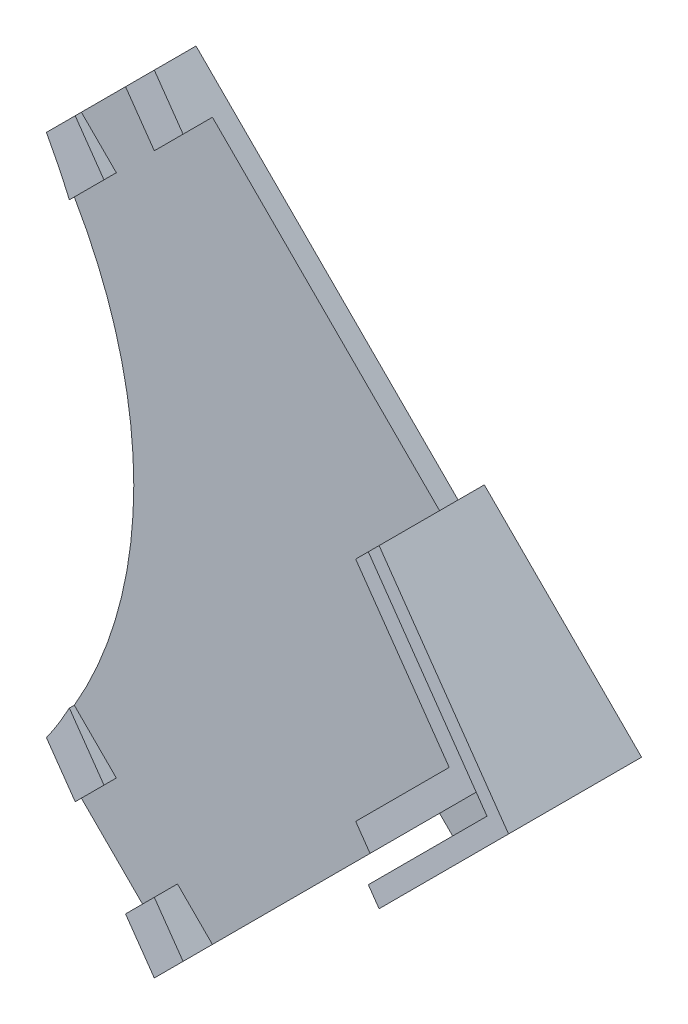
ISO-10303-21;
HEADER;
FILE_DESCRIPTION(('STEP AP214'),'2;1');
FILE_NAME('part.step','',(''),(''),'','','');
FILE_SCHEMA(('AUTOMOTIVE_DESIGN { 1 0 10303 214 1 1 1 1 }'));
ENDSEC;
DATA;
#1=APPLICATION_CONTEXT('core data for automotive mechanical design processes');
#2=APPLICATION_PROTOCOL_DEFINITION('international standard','automotive_design',2000,#1);
#3=PRODUCT_CONTEXT('',#1,'mechanical');
#4=PRODUCT('Part','Part','',(#3));
#5=PRODUCT_RELATED_PRODUCT_CATEGORY('part','',(#4));
#6=PRODUCT_DEFINITION_FORMATION('','',#4);
#7=PRODUCT_DEFINITION_CONTEXT('part definition',#1,'design');
#8=PRODUCT_DEFINITION('design','',#6,#7);
#9=PRODUCT_DEFINITION_SHAPE('','',#8);
#10=(LENGTH_UNIT() NAMED_UNIT(*) SI_UNIT(.MILLI.,.METRE.));
#11=(NAMED_UNIT(*) PLANE_ANGLE_UNIT() SI_UNIT($,.RADIAN.));
#12=(NAMED_UNIT(*) SI_UNIT($,.STERADIAN.) SOLID_ANGLE_UNIT());
#13=UNCERTAINTY_MEASURE_WITH_UNIT(LENGTH_MEASURE(1.E-05),#10,'distance_accuracy_value','');
#14=(GEOMETRIC_REPRESENTATION_CONTEXT(3) GLOBAL_UNCERTAINTY_ASSIGNED_CONTEXT((#13)) GLOBAL_UNIT_ASSIGNED_CONTEXT((#10,
#11,#12)) REPRESENTATION_CONTEXT('',''));
#15=CARTESIAN_POINT('',(0.,0.,0.));
#16=DIRECTION('',(0.,0.,1.));
#17=DIRECTION('',(1.,0.,0.));
#18=AXIS2_PLACEMENT_3D('',#15,#16,#17);
#19=CARTESIAN_POINT('',(0.,0.,3.));
#20=DIRECTION('',(0.,0.,1.));
#21=DIRECTION('',(1.,0.,0.));
#22=AXIS2_PLACEMENT_3D('',#19,#20,#21);
#23=PLANE('',#22);
#24=DIRECTION('',(0.707106781186547,-0.707106781186548,0.));
#25=VECTOR('',#24,1.);
#26=CARTESIAN_POINT('',(117.379725676967,-18.3847763108502,3.));
#27=LINE('',#26,#25);
#28=CARTESIAN_POINT('',(120.208152801713,-21.2132034355964,3.));
#29=VERTEX_POINT('',#28);
#30=CARTESIAN_POINT('',(122.329473145273,-23.3345237791561,3.));
#31=VERTEX_POINT('',#30);
#32=EDGE_CURVE('E260',#29,#31,#27,.T.);
#33=ORIENTED_EDGE('',*,*,#32,.T.);
#34=DIRECTION('',(0.707106781186548,0.707106781186547,0.));
#35=VECTOR('',#34,1.);
#36=CARTESIAN_POINT('',(72.8319984622144,-72.8319984622144,3.));
#37=LINE('',#36,#35);
#38=CARTESIAN_POINT('',(145.663996924429,0.,3.));
#39=VERTEX_POINT('',#38);
#40=EDGE_CURVE('E244',#31,#39,#37,.T.);
#41=ORIENTED_EDGE('',*,*,#40,.T.);
#42=DIRECTION('',(-0.707106781186548,0.707106781186547,0.));
#43=VECTOR('',#42,1.);
#44=CARTESIAN_POINT('',(72.8319984622144,72.8319984622144,3.));
#45=LINE('',#44,#43);
#46=CARTESIAN_POINT('',(122.329473145273,23.3345237791561,3.));
#47=VERTEX_POINT('',#46);
#48=EDGE_CURVE('E257',#39,#47,#45,.T.);
#49=ORIENTED_EDGE('',*,*,#48,.T.);
#50=DIRECTION('',(-0.707106781186547,-0.707106781186548,0.));
#51=VECTOR('',#50,1.);
#52=CARTESIAN_POINT('',(124.450793488832,25.4558441227157,3.));
#53=LINE('',#52,#51);
#54=CARTESIAN_POINT('',(120.208152801713,21.2132034355964,3.));
#55=VERTEX_POINT('',#54);
#56=EDGE_CURVE('E268',#47,#55,#53,.T.);
#57=ORIENTED_EDGE('',*,*,#56,.T.);
#58=DIRECTION('',(-0.707106781186548,0.707106781186548,0.));
#59=VECTOR('',#58,1.);
#60=CARTESIAN_POINT('',(141.42135623731,0.,3.));
#61=LINE('',#60,#59);
#62=CARTESIAN_POINT('',(141.42135623731,0.,3.));
#63=VERTEX_POINT('',#62);
#64=EDGE_CURVE('E281',#63,#55,#61,.T.);
#65=ORIENTED_EDGE('',*,*,#64,.F.);
#66=DIRECTION('',(0.707106781186548,0.707106781186548,0.));
#67=VECTOR('',#66,1.);
#68=CARTESIAN_POINT('',(77.7817459305202,-63.6396103067893,3.));
#69=LINE('',#68,#67);
#70=EDGE_CURVE('E284',#29,#63,#69,.T.);
#71=ORIENTED_EDGE('',*,*,#70,.F.);
#72=EDGE_LOOP('',(#33,#41,#49,#57,#65,#71));
#73=FACE_BOUND('',#72,.T.);
#74=ADVANCED_FACE('F37',(#73),#23,.T.);
#75=CARTESIAN_POINT('',(122.329473145273,23.3345237791561,22.));
#76=DIRECTION('',(0.707106781186547,0.707106781186548,0.));
#77=DIRECTION('',(-0.707106781186548,0.707106781186547,0.));
#78=AXIS2_PLACEMENT_3D('',#75,#76,#77);
#79=PLANE('',#78);
#80=DIRECTION('',(0.,0.,-1.));
#81=VECTOR('',#80,1.);
#82=CARTESIAN_POINT('',(145.663996924429,0.,22.));
#83=LINE('',#82,#81);
#84=CARTESIAN_POINT('',(145.663996924429,0.,20.781009601159));
#85=VERTEX_POINT('',#84);
#86=EDGE_CURVE('E246',#85,#39,#83,.T.);
#87=ORIENTED_EDGE('',*,*,#86,.F.);
#88=DIRECTION('',(-0.701646415445623,0.701646415445623,-0.124034734589208));
#89=VECTOR('',#88,1.);
#90=CARTESIAN_POINT('',(122.794552757533,22.8694441668956,16.7382248380642));
#91=LINE('',#90,#89);
#92=CARTESIAN_POINT('',(122.329473145273,23.3345237791561,16.656009601159));
#93=VERTEX_POINT('',#92);
#94=EDGE_CURVE('E52',#85,#93,#91,.T.);
#95=ORIENTED_EDGE('',*,*,#94,.T.);
#96=DIRECTION('',(0.,0.,-1.));
#97=VECTOR('',#96,1.);
#98=CARTESIAN_POINT('',(122.329473145273,23.3345237791561,22.));
#99=LINE('',#98,#97);
#100=EDGE_CURVE('E58',#93,#47,#99,.T.);
#101=ORIENTED_EDGE('',*,*,#100,.T.);
#102=ORIENTED_EDGE('',*,*,#48,.F.);
#103=EDGE_LOOP('',(#87,#95,#101,#102));
#104=FACE_BOUND('',#103,.T.);
#105=ADVANCED_FACE('F553',(#104),#79,.F.);
#106=CARTESIAN_POINT('',(77.7817459305202,-63.6396103067893,3.));
#107=DIRECTION('',(-0.707106781186548,0.707106781186548,0.));
#108=DIRECTION('',(-0.707106781186548,-0.707106781186548,0.));
#109=AXIS2_PLACEMENT_3D('',#106,#107,#108);
#110=PLANE('',#109);
#111=DIRECTION('',(0.,0.,-1.));
#112=VECTOR('',#111,1.);
#113=CARTESIAN_POINT('',(120.208152801713,-21.2132034355964,3.));
#114=LINE('',#113,#112);
#115=CARTESIAN_POINT('',(120.208152801713,-21.2132034355964,0.));
#116=VERTEX_POINT('',#115);
#117=EDGE_CURVE('E264',#29,#116,#114,.T.);
#118=ORIENTED_EDGE('',*,*,#117,.F.);
#119=DIRECTION('',(0.707106781186547,0.707106781186547,0.));
#120=VECTOR('',#119,1.);
#121=CARTESIAN_POINT('',(77.7817459305202,-63.6396103067893,3.));
#122=LINE('',#121,#120);
#123=CARTESIAN_POINT('',(83.4386001800126,-57.9827560572969,3.));
#124=VERTEX_POINT('',#123);
#125=EDGE_CURVE('E418',#124,#29,#122,.T.);
#126=ORIENTED_EDGE('',*,*,#125,.F.);
#127=DIRECTION('',(0.,0.,-1.));
#128=VECTOR('',#127,1.);
#129=CARTESIAN_POINT('',(83.4386001800126,-57.9827560572969,20.));
#130=LINE('',#129,#128);
#131=CARTESIAN_POINT('',(83.4386001800126,-57.9827560572969,7.74999999999999));
#132=VERTEX_POINT('',#131);
#133=EDGE_CURVE('E368',#132,#124,#130,.T.);
#134=ORIENTED_EDGE('',*,*,#133,.F.);
#135=DIRECTION('',(-0.701646415445623,-0.701646415445623,-0.124034734589208));
#136=VECTOR('',#135,1.);
#137=CARTESIAN_POINT('',(77.455388954588,-63.9659672827215,6.69230769230769));
#138=LINE('',#137,#136);
#139=CARTESIAN_POINT('',(77.7817459305202,-63.6396103067893,6.75000000000001));
#140=VERTEX_POINT('',#139);
#141=EDGE_CURVE('E296',#132,#140,#138,.T.);
#142=ORIENTED_EDGE('',*,*,#141,.T.);
#143=DIRECTION('',(0.,0.,-1.));
#144=VECTOR('',#143,1.);
#145=CARTESIAN_POINT('',(77.7817459305202,-63.6396103067893,3.));
#146=LINE('',#145,#144);
#147=CARTESIAN_POINT('',(77.7817459305202,-63.6396103067893,0.));
#148=VERTEX_POINT('',#147);
#149=EDGE_CURVE('E452',#140,#148,#146,.T.);
#150=ORIENTED_EDGE('',*,*,#149,.T.);
#151=DIRECTION('',(0.707106781186547,0.707106781186547,0.));
#152=VECTOR('',#151,1.);
#153=CARTESIAN_POINT('',(77.7817459305202,-63.6396103067893,0.));
#154=LINE('',#153,#152);
#155=EDGE_CURVE('E434',#148,#116,#154,.T.);
#156=ORIENTED_EDGE('',*,*,#155,.T.);
#157=EDGE_LOOP('',(#118,#126,#134,#142,#150,#156));
#158=FACE_BOUND('',#157,.T.);
#159=ADVANCED_FACE('F531',(#158),#110,.F.);
#160=DIRECTION('',(0.,0.,-1.));
#161=VECTOR('',#160,1.);
#162=CARTESIAN_POINT('',(120.208152801713,-21.2132034355964,22.));
#163=LINE('',#162,#161);
#164=CARTESIAN_POINT('',(120.208152801713,-21.2132034355964,14.25));
#165=VERTEX_POINT('',#164);
#166=EDGE_CURVE('E342',#165,#29,#163,.T.);
#167=ORIENTED_EDGE('',*,*,#166,.T.);
#168=ORIENTED_EDGE('',*,*,#70,.T.);
#169=DIRECTION('',(0.,0.,-1.));
#170=VECTOR('',#169,1.);
#171=CARTESIAN_POINT('',(141.42135623731,0.,3.));
#172=LINE('',#171,#170);
#173=CARTESIAN_POINT('',(141.42135623731,0.,18.));
#174=VERTEX_POINT('',#173);
#175=EDGE_CURVE('E449',#174,#63,#172,.T.);
#176=ORIENTED_EDGE('',*,*,#175,.F.);
#177=EDGE_CURVE('E292',#174,#165,#138,.T.);
#178=ORIENTED_EDGE('',*,*,#177,.T.);
#179=EDGE_LOOP('',(#167,#168,#176,#178));
#180=FACE_BOUND('',#179,.T.);
#181=ADVANCED_FACE('F537',(#180),#110,.F.);
#182=CARTESIAN_POINT('',(141.42135623731,0.,3.));
#183=DIRECTION('',(-0.707106781186548,-0.707106781186548,0.));
#184=DIRECTION('',(0.707106781186548,-0.707106781186548,0.));
#185=AXIS2_PLACEMENT_3D('',#182,#183,#184);
#186=PLANE('',#185);
#187=DIRECTION('',(0.,0.,1.));
#188=VECTOR('',#187,1.);
#189=CARTESIAN_POINT('',(120.208152801713,21.2132034355964,3.));
#190=LINE('',#189,#188);
#191=CARTESIAN_POINT('',(120.208152801713,21.2132034355964,0.));
#192=VERTEX_POINT('',#191);
#193=EDGE_CURVE('E286',#192,#55,#190,.T.);
#194=ORIENTED_EDGE('',*,*,#193,.F.);
#195=DIRECTION('',(-0.707106781186547,0.707106781186547,0.));
#196=VECTOR('',#195,1.);
#197=CARTESIAN_POINT('',(141.42135623731,0.,0.));
#198=LINE('',#197,#196);
#199=CARTESIAN_POINT('',(77.7817459305202,63.6396103067893,0.));
#200=VERTEX_POINT('',#199);
#201=EDGE_CURVE('E436',#192,#200,#198,.T.);
#202=ORIENTED_EDGE('',*,*,#201,.T.);
#203=DIRECTION('',(0.,0.,-1.));
#204=VECTOR('',#203,1.);
#205=CARTESIAN_POINT('',(77.7817459305202,63.6396103067893,3.));
#206=LINE('',#205,#204);
#207=CARTESIAN_POINT('',(77.7817459305202,63.6396103067893,6.75000000000001));
#208=VERTEX_POINT('',#207);
#209=EDGE_CURVE('E446',#208,#200,#206,.T.);
#210=ORIENTED_EDGE('',*,*,#209,.F.);
#211=DIRECTION('',(0.701646415445623,-0.701646415445623,0.124034734589208));
#212=VECTOR('',#211,1.);
#213=CARTESIAN_POINT('',(140.11592833358,1.30542790372901,17.7692307692308));
#214=LINE('',#213,#212);
#215=CARTESIAN_POINT('',(83.4386001800126,57.9827560572969,7.74999999999999));
#216=VERTEX_POINT('',#215);
#217=EDGE_CURVE('E306',#208,#216,#214,.T.);
#218=ORIENTED_EDGE('',*,*,#217,.T.);
#219=DIRECTION('',(0.,0.,-1.));
#220=VECTOR('',#219,1.);
#221=CARTESIAN_POINT('',(83.4386001800126,57.9827560572969,20.));
#222=LINE('',#221,#220);
#223=CARTESIAN_POINT('',(83.4386001800126,57.9827560572969,3.));
#224=VERTEX_POINT('',#223);
#225=EDGE_CURVE('E378',#216,#224,#222,.T.);
#226=ORIENTED_EDGE('',*,*,#225,.T.);
#227=DIRECTION('',(-0.707106781186547,0.707106781186547,0.));
#228=VECTOR('',#227,1.);
#229=CARTESIAN_POINT('',(141.42135623731,0.,3.));
#230=LINE('',#229,#228);
#231=EDGE_CURVE('E422',#55,#224,#230,.T.);
#232=ORIENTED_EDGE('',*,*,#231,.F.);
#233=EDGE_LOOP('',(#194,#202,#210,#218,#226,#232));
#234=FACE_BOUND('',#233,.T.);
#235=ADVANCED_FACE('F475',(#234),#186,.F.);
#236=CARTESIAN_POINT('',(0.,0.,3.));
#237=DIRECTION('',(0.,0.,-1.));
#238=DIRECTION('',(-1.,0.,0.));
#239=AXIS2_PLACEMENT_3D('',#236,#237,#238);
#240=PLANE('',#239);
#241=DIRECTION('',(-0.707106781186548,-0.707106781186547,0.));
#242=VECTOR('',#241,1.);
#243=CARTESIAN_POINT('',(67.8822509939085,-67.8822509939086,3.));
#244=LINE('',#243,#242);
#245=CARTESIAN_POINT('',(135.764501987817,0.,3.));
#246=VERTEX_POINT('',#245);
#247=CARTESIAN_POINT('',(117.379725676967,-18.3847763108502,3.));
#248=VERTEX_POINT('',#247);
#249=EDGE_CURVE('E349',#246,#248,#244,.T.);
#250=ORIENTED_EDGE('',*,*,#249,.F.);
#251=DIRECTION('',(0.707106781186548,-0.707106781186547,0.));
#252=VECTOR('',#251,1.);
#253=CARTESIAN_POINT('',(67.8822509939085,67.8822509939086,3.));
#254=LINE('',#253,#252);
#255=CARTESIAN_POINT('',(117.379725676967,18.3847763108502,3.));
#256=VERTEX_POINT('',#255);
#257=EDGE_CURVE('E360',#256,#246,#254,.T.);
#258=ORIENTED_EDGE('',*,*,#257,.F.);
#259=DIRECTION('',(-0.707106781186547,-0.707106781186548,0.));
#260=VECTOR('',#259,1.);
#261=CARTESIAN_POINT('',(49.4974746830584,-49.4974746830584,3.));
#262=LINE('',#261,#260);
#263=EDGE_CURVE('E363',#55,#256,#262,.T.);
#264=ORIENTED_EDGE('',*,*,#263,.F.);
#265=ORIENTED_EDGE('',*,*,#231,.T.);
#266=DIRECTION('',(0.707106781186547,0.707106781186548,0.));
#267=VECTOR('',#266,1.);
#268=CARTESIAN_POINT('',(12.7279220613579,-12.7279220613579,3.));
#269=LINE('',#268,#267);
#270=CARTESIAN_POINT('',(77.7817459305202,52.3259018078045,3.));
#271=VERTEX_POINT('',#270);
#272=EDGE_CURVE('E384',#271,#224,#269,.T.);
#273=ORIENTED_EDGE('',*,*,#272,.F.);
#274=DIRECTION('',(0.707106781186548,-0.707106781186547,0.));
#275=VECTOR('',#274,1.);
#276=CARTESIAN_POINT('',(65.0538238691623,65.0538238691624,3.));
#277=LINE('',#276,#275);
#278=CARTESIAN_POINT('',(72.1248916810278,57.9827560572969,3.));
#279=VERTEX_POINT('',#278);
#280=EDGE_CURVE('E387',#279,#271,#277,.T.);
#281=ORIENTED_EDGE('',*,*,#280,.F.);
#282=DIRECTION('',(-0.707106781186547,-0.707106781186547,0.));
#283=VECTOR('',#282,1.);
#284=CARTESIAN_POINT('',(77.7817459305202,63.6396103067893,3.));
#285=LINE('',#284,#283);
#286=CARTESIAN_POINT('',(62.2253967444162,48.0832611206852,3.));
#287=VERTEX_POINT('',#286);
#288=EDGE_CURVE('E425',#279,#287,#285,.T.);
#289=ORIENTED_EDGE('',*,*,#288,.T.);
#290=DIRECTION('',(-0.707106781186548,0.707106781186548,0.));
#291=VECTOR('',#290,1.);
#292=CARTESIAN_POINT('',(55.1543289325507,55.1543289325507,3.));
#293=LINE('',#292,#291);
#294=CARTESIAN_POINT('',(67.8822509939086,42.4264068711929,3.));
#295=VERTEX_POINT('',#294);
#296=EDGE_CURVE('E408',#295,#287,#293,.T.);
#297=ORIENTED_EDGE('',*,*,#296,.F.);
#298=DIRECTION('',(0.707106781186548,0.707106781186548,0.));
#299=VECTOR('',#298,1.);
#300=CARTESIAN_POINT('',(12.7279220613578,-12.7279220613579,3.));
#301=LINE('',#300,#299);
#302=CARTESIAN_POINT('',(61.0807916763042,35.6249475535885,3.));
#303=VERTEX_POINT('',#302);
#304=EDGE_CURVE('E411',#303,#295,#301,.T.);
#305=ORIENTED_EDGE('',*,*,#304,.F.);
#306=CARTESIAN_POINT('',(0.,0.,3.));
#307=DIRECTION('',(0.,0.,-1.));
#308=DIRECTION('',(-1.,0.,0.));
#309=AXIS2_PLACEMENT_3D('',#306,#307,#308);
#310=CIRCLE('',#309,70.7106781186548);
#311=CARTESIAN_POINT('',(61.0807916763042,-35.6249475535885,3.));
#312=VERTEX_POINT('',#311);
#313=EDGE_CURVE('E428',#303,#312,#310,.T.);
#314=ORIENTED_EDGE('',*,*,#313,.T.);
#315=DIRECTION('',(-0.707106781186548,0.707106781186548,0.));
#316=VECTOR('',#315,1.);
#317=CARTESIAN_POINT('',(12.7279220613578,12.7279220613579,3.));
#318=LINE('',#317,#316);
#319=CARTESIAN_POINT('',(67.8822509939086,-42.4264068711928,3.));
#320=VERTEX_POINT('',#319);
#321=EDGE_CURVE('E396',#320,#312,#318,.T.);
#322=ORIENTED_EDGE('',*,*,#321,.F.);
#323=DIRECTION('',(0.707106781186548,0.707106781186548,0.));
#324=VECTOR('',#323,1.);
#325=CARTESIAN_POINT('',(55.1543289325507,-55.1543289325507,3.));
#326=LINE('',#325,#324);
#327=CARTESIAN_POINT('',(62.2253967444162,-48.0832611206852,3.));
#328=VERTEX_POINT('',#327);
#329=EDGE_CURVE('E399',#328,#320,#326,.T.);
#330=ORIENTED_EDGE('',*,*,#329,.F.);
#331=DIRECTION('',(0.707106781186547,-0.707106781186547,0.));
#332=VECTOR('',#331,1.);
#333=CARTESIAN_POINT('',(56.5685424949238,-42.4264068711928,3.));
#334=LINE('',#333,#332);
#335=CARTESIAN_POINT('',(72.1248916810278,-57.9827560572969,3.));
#336=VERTEX_POINT('',#335);
#337=EDGE_CURVE('E415',#328,#336,#334,.T.);
#338=ORIENTED_EDGE('',*,*,#337,.T.);
#339=DIRECTION('',(-0.707106781186548,-0.707106781186547,0.));
#340=VECTOR('',#339,1.);
#341=CARTESIAN_POINT('',(65.0538238691623,-65.0538238691624,3.));
#342=LINE('',#341,#340);
#343=CARTESIAN_POINT('',(77.7817459305202,-52.3259018078045,3.));
#344=VERTEX_POINT('',#343);
#345=EDGE_CURVE('E375',#344,#336,#342,.T.);
#346=ORIENTED_EDGE('',*,*,#345,.F.);
#347=DIRECTION('',(-0.707106781186547,0.707106781186548,0.));
#348=VECTOR('',#347,1.);
#349=CARTESIAN_POINT('',(12.7279220613579,12.7279220613579,3.));
#350=LINE('',#349,#348);
#351=EDGE_CURVE('E372',#124,#344,#350,.T.);
#352=ORIENTED_EDGE('',*,*,#351,.F.);
#353=ORIENTED_EDGE('',*,*,#125,.T.);
#354=DIRECTION('',(0.707106781186547,-0.707106781186548,0.));
#355=VECTOR('',#354,1.);
#356=CARTESIAN_POINT('',(49.4974746830585,49.4974746830584,3.));
#357=LINE('',#356,#355);
#358=EDGE_CURVE('E352',#248,#29,#357,.T.);
#359=ORIENTED_EDGE('',*,*,#358,.F.);
#360=EDGE_LOOP('',(#250,#258,#264,#265,#273,#281,#289,#297,#305,#314,#322,#330,#338,#346,#352,
#353,#359));
#361=FACE_BOUND('',#360,.T.);
#362=ADVANCED_FACE('F466',(#361),#240,.F.);
#363=CARTESIAN_POINT('',(117.379725676967,18.3847763108502,22.));
#364=DIRECTION('',(0.707106781186547,0.707106781186548,0.));
#365=DIRECTION('',(-0.707106781186548,0.707106781186547,0.));
#366=AXIS2_PLACEMENT_3D('',#363,#364,#365);
#367=PLANE('',#366);
#368=DIRECTION('',(0.,0.,-1.));
#369=VECTOR('',#368,1.);
#370=CARTESIAN_POINT('',(135.764501987817,0.,22.));
#371=LINE('',#370,#369);
#372=CARTESIAN_POINT('',(135.764501987817,0.,17.));
#373=VERTEX_POINT('',#372);
#374=EDGE_CURVE('E347',#373,#246,#371,.T.);
#375=ORIENTED_EDGE('',*,*,#374,.F.);
#376=DIRECTION('',(-0.701646415445623,0.701646415445623,-0.124034734589208));
#377=VECTOR('',#376,1.);
#378=CARTESIAN_POINT('',(118.097711024018,17.6667909637993,13.8769230769231));
#379=LINE('',#378,#377);
#380=CARTESIAN_POINT('',(117.379725676967,18.3847763108502,13.75));
#381=VERTEX_POINT('',#380);
#382=EDGE_CURVE('E295',#373,#381,#379,.T.);
#383=ORIENTED_EDGE('',*,*,#382,.T.);
#384=DIRECTION('',(0.,0.,-1.));
#385=VECTOR('',#384,1.);
#386=CARTESIAN_POINT('',(117.379725676967,18.3847763108502,22.));
#387=LINE('',#386,#385);
#388=EDGE_CURVE('E358',#381,#256,#387,.T.);
#389=ORIENTED_EDGE('',*,*,#388,.T.);
#390=ORIENTED_EDGE('',*,*,#257,.T.);
#391=EDGE_LOOP('',(#375,#383,#389,#390));
#392=FACE_BOUND('',#391,.T.);
#393=ADVANCED_FACE('F461',(#392),#367,.F.);
#394=CARTESIAN_POINT('',(56.5685424949238,-42.4264068711928,3.));
#395=DIRECTION('',(0.707106781186548,0.707106781186548,0.));
#396=DIRECTION('',(-0.707106781186548,0.707106781186548,0.));
#397=AXIS2_PLACEMENT_3D('',#394,#395,#396);
#398=PLANE('',#397);
#399=ORIENTED_EDGE('',*,*,#149,.F.);
#400=DIRECTION('',(-0.701646415445623,0.701646415445623,-0.124034734589208));
#401=VECTOR('',#400,1.);
#402=CARTESIAN_POINT('',(56.5685424949238,-42.4264068711928,3.));
#403=LINE('',#402,#401);
#404=CARTESIAN_POINT('',(72.1248916810278,-57.9827560572969,5.74999999999999));
#405=VERTEX_POINT('',#404);
#406=EDGE_CURVE('E312',#140,#405,#403,.T.);
#407=ORIENTED_EDGE('',*,*,#406,.T.);
#408=DIRECTION('',(0.,0.,-1.));
#409=VECTOR('',#408,1.);
#410=CARTESIAN_POINT('',(72.1248916810278,-57.9827560572969,20.));
#411=LINE('',#410,#409);
#412=EDGE_CURVE('E370',#405,#336,#411,.T.);
#413=ORIENTED_EDGE('',*,*,#412,.T.);
#414=ORIENTED_EDGE('',*,*,#337,.F.);
#415=DIRECTION('',(0.,0.,-1.));
#416=VECTOR('',#415,1.);
#417=CARTESIAN_POINT('',(62.2253967444162,-48.0832611206852,20.));
#418=LINE('',#417,#416);
#419=CARTESIAN_POINT('',(62.2253967444162,-48.0832611206852,3.99999999999999));
#420=VERTEX_POINT('',#419);
#421=EDGE_CURVE('E394',#420,#328,#418,.T.);
#422=ORIENTED_EDGE('',*,*,#421,.F.);
#423=CARTESIAN_POINT('',(56.5685424949238,-42.4264068711928,3.));
#424=VERTEX_POINT('',#423);
#425=EDGE_CURVE('E316',#420,#424,#403,.T.);
#426=ORIENTED_EDGE('',*,*,#425,.T.);
#427=DIRECTION('',(0.,0.,-1.));
#428=VECTOR('',#427,1.);
#429=CARTESIAN_POINT('',(56.5685424949238,-42.4264068711928,3.));
#430=LINE('',#429,#428);
#431=CARTESIAN_POINT('',(56.5685424949238,-42.4264068711928,0.));
#432=VERTEX_POINT('',#431);
#433=EDGE_CURVE('E431',#424,#432,#430,.T.);
#434=ORIENTED_EDGE('',*,*,#433,.T.);
#435=DIRECTION('',(0.707106781186547,-0.707106781186547,0.));
#436=VECTOR('',#435,1.);
#437=CARTESIAN_POINT('',(56.5685424949238,-42.4264068711928,0.));
#438=LINE('',#437,#436);
#439=EDGE_CURVE('E414',#432,#148,#438,.T.);
#440=ORIENTED_EDGE('',*,*,#439,.T.);
#441=EDGE_LOOP('',(#399,#407,#413,#414,#422,#426,#434,#440));
#442=FACE_BOUND('',#441,.T.);
#443=ADVANCED_FACE('F39',(#442),#398,.F.);
#444=ORIENTED_EDGE('',*,*,#175,.T.);
#445=ORIENTED_EDGE('',*,*,#64,.T.);
#446=DIRECTION('',(0.,0.,-1.));
#447=VECTOR('',#446,1.);
#448=CARTESIAN_POINT('',(120.208152801713,21.2132034355964,22.));
#449=LINE('',#448,#447);
#450=CARTESIAN_POINT('',(120.208152801713,21.2132034355964,14.25));
#451=VERTEX_POINT('',#450);
#452=EDGE_CURVE('E355',#451,#55,#449,.T.);
#453=ORIENTED_EDGE('',*,*,#452,.F.);
#454=EDGE_CURVE('E302',#451,#174,#214,.T.);
#455=ORIENTED_EDGE('',*,*,#454,.T.);
#456=EDGE_LOOP('',(#444,#445,#453,#455));
#457=FACE_BOUND('',#456,.T.);
#458=ADVANCED_FACE('F539',(#457),#186,.F.);
#459=CARTESIAN_POINT('',(77.7817459305202,63.6396103067893,3.));
#460=DIRECTION('',(0.707106781186548,-0.707106781186548,0.));
#461=DIRECTION('',(0.707106781186548,0.707106781186548,0.));
#462=AXIS2_PLACEMENT_3D('',#459,#460,#461);
#463=PLANE('',#462);
#464=DIRECTION('',(0.,0.,-1.));
#465=VECTOR('',#464,1.);
#466=CARTESIAN_POINT('',(56.5685424949238,42.4264068711928,3.));
#467=LINE('',#466,#465);
#468=CARTESIAN_POINT('',(56.5685424949238,42.4264068711928,3.));
#469=VERTEX_POINT('',#468);
#470=CARTESIAN_POINT('',(56.5685424949238,42.4264068711928,0.));
#471=VERTEX_POINT('',#470);
#472=EDGE_CURVE('E444',#469,#471,#467,.T.);
#473=ORIENTED_EDGE('',*,*,#472,.F.);
#474=DIRECTION('',(0.701646415445623,0.701646415445623,0.124034734589208));
#475=VECTOR('',#474,1.);
#476=CARTESIAN_POINT('',(77.455388954588,63.313253330857,6.69230769230769));
#477=LINE('',#476,#475);
#478=CARTESIAN_POINT('',(62.2253967444162,48.0832611206852,3.99999999999999));
#479=VERTEX_POINT('',#478);
#480=EDGE_CURVE('E325',#469,#479,#477,.T.);
#481=ORIENTED_EDGE('',*,*,#480,.T.);
#482=DIRECTION('',(0.,0.,-1.));
#483=VECTOR('',#482,1.);
#484=CARTESIAN_POINT('',(62.2253967444162,48.0832611206852,20.));
#485=LINE('',#484,#483);
#486=EDGE_CURVE('E402',#479,#287,#485,.T.);
#487=ORIENTED_EDGE('',*,*,#486,.T.);
#488=ORIENTED_EDGE('',*,*,#288,.F.);
#489=DIRECTION('',(0.,0.,-1.));
#490=VECTOR('',#489,1.);
#491=CARTESIAN_POINT('',(72.1248916810278,57.9827560572969,20.));
#492=LINE('',#491,#490);
#493=CARTESIAN_POINT('',(72.1248916810278,57.9827560572969,5.74999999999999));
#494=VERTEX_POINT('',#493);
#495=EDGE_CURVE('E382',#494,#279,#492,.T.);
#496=ORIENTED_EDGE('',*,*,#495,.F.);
#497=EDGE_CURVE('E322',#494,#208,#477,.T.);
#498=ORIENTED_EDGE('',*,*,#497,.T.);
#499=ORIENTED_EDGE('',*,*,#209,.T.);
#500=DIRECTION('',(-0.707106781186547,-0.707106781186547,0.));
#501=VECTOR('',#500,1.);
#502=CARTESIAN_POINT('',(77.7817459305202,63.6396103067893,0.));
#503=LINE('',#502,#501);
#504=EDGE_CURVE('E438',#200,#471,#503,.T.);
#505=ORIENTED_EDGE('',*,*,#504,.T.);
#506=EDGE_LOOP('',(#473,#481,#487,#488,#496,#498,#499,#505));
#507=FACE_BOUND('',#506,.T.);
#508=ADVANCED_FACE('F490',(#507),#463,.F.);
#509=CARTESIAN_POINT('',(0.,0.,3.));
#510=DIRECTION('',(0.,0.,-1.));
#511=DIRECTION('',(-1.,0.,0.));
#512=AXIS2_PLACEMENT_3D('',#509,#510,#511);
#513=CYLINDRICAL_SURFACE('',#512,70.7106781186548);
#514=ORIENTED_EDGE('',*,*,#433,.F.);
#515=CARTESIAN_POINT('',(0.,0.,-7.00000000000001));
#516=DIRECTION('',(0.174077655955698,0.,-0.984731927834662));
#517=DIRECTION('',(-0.984731927834662,0.,-0.174077655955698));
#518=AXIS2_PLACEMENT_3D('',#515,#516,#517);
#519=ELLIPSE('',#518,71.8070330817254,70.7106781186548);
#520=CARTESIAN_POINT('',(61.0807916763042,-35.6249475535885,3.79766049863937));
#521=VERTEX_POINT('',#520);
#522=EDGE_CURVE('E332',#424,#521,#519,.F.);
#523=ORIENTED_EDGE('',*,*,#522,.T.);
#524=DIRECTION('',(0.,0.,-1.));
#525=VECTOR('',#524,1.);
#526=CARTESIAN_POINT('',(61.0807916763042,-35.6249475535885,20.));
#527=LINE('',#526,#525);
#528=EDGE_CURVE('E390',#521,#312,#527,.T.);
#529=ORIENTED_EDGE('',*,*,#528,.T.);
#530=ORIENTED_EDGE('',*,*,#313,.F.);
#531=DIRECTION('',(0.,0.,-1.));
#532=VECTOR('',#531,1.);
#533=CARTESIAN_POINT('',(61.0807916763042,35.6249475535885,20.));
#534=LINE('',#533,#532);
#535=CARTESIAN_POINT('',(61.0807916763042,35.6249475535885,3.79766049863937));
#536=VERTEX_POINT('',#535);
#537=EDGE_CURVE('E406',#536,#303,#534,.T.);
#538=ORIENTED_EDGE('',*,*,#537,.F.);
#539=EDGE_CURVE('E335',#536,#469,#519,.F.);
#540=ORIENTED_EDGE('',*,*,#539,.T.);
#541=ORIENTED_EDGE('',*,*,#472,.T.);
#542=CARTESIAN_POINT('',(0.,0.,0.));
#543=DIRECTION('',(0.,0.,-1.));
#544=DIRECTION('',(-1.,0.,0.));
#545=AXIS2_PLACEMENT_3D('',#542,#543,#544);
#546=CIRCLE('',#545,70.7106781186548);
#547=EDGE_CURVE('E419',#471,#432,#546,.T.);
#548=ORIENTED_EDGE('',*,*,#547,.T.);
#549=EDGE_LOOP('',(#514,#523,#529,#530,#538,#540,#541,#548));
#550=FACE_BOUND('',#549,.T.);
#551=ADVANCED_FACE('F504',(#550),#513,.F.);
#552=CARTESIAN_POINT('',(0.,0.,0.));
#553=DIRECTION('',(0.,0.,-1.));
#554=DIRECTION('',(-1.,0.,0.));
#555=AXIS2_PLACEMENT_3D('',#552,#553,#554);
#556=PLANE('',#555);
#557=DIRECTION('',(0.707106781186548,0.707106781186547,0.));
#558=VECTOR('',#557,1.);
#559=CARTESIAN_POINT('',(142.835569799683,-7.07106781186548,0.));
#560=LINE('',#559,#558);
#561=CARTESIAN_POINT('',(124.450793488832,-25.4558441227157,0.));
#562=VERTEX_POINT('',#561);
#563=CARTESIAN_POINT('',(149.906637611548,0.,0.));
#564=VERTEX_POINT('',#563);
#565=EDGE_CURVE('E273',#562,#564,#560,.T.);
#566=ORIENTED_EDGE('',*,*,#565,.F.);
#567=DIRECTION('',(0.707106781186547,-0.707106781186548,0.));
#568=VECTOR('',#567,1.);
#569=CARTESIAN_POINT('',(117.379725676967,-18.3847763108502,0.));
#570=LINE('',#569,#568);
#571=EDGE_CURVE('E259',#116,#562,#570,.T.);
#572=ORIENTED_EDGE('',*,*,#571,.F.);
#573=ORIENTED_EDGE('',*,*,#155,.F.);
#574=ORIENTED_EDGE('',*,*,#439,.F.);
#575=ORIENTED_EDGE('',*,*,#547,.F.);
#576=ORIENTED_EDGE('',*,*,#504,.F.);
#577=ORIENTED_EDGE('',*,*,#201,.F.);
#578=DIRECTION('',(-0.707106781186547,-0.707106781186548,0.));
#579=VECTOR('',#578,1.);
#580=CARTESIAN_POINT('',(124.450793488832,25.4558441227157,0.));
#581=LINE('',#580,#579);
#582=CARTESIAN_POINT('',(124.450793488832,25.4558441227157,0.));
#583=VERTEX_POINT('',#582);
#584=EDGE_CURVE('E267',#583,#192,#581,.T.);
#585=ORIENTED_EDGE('',*,*,#584,.F.);
#586=DIRECTION('',(-0.707106781186548,0.707106781186547,0.));
#587=VECTOR('',#586,1.);
#588=CARTESIAN_POINT('',(149.906637611548,0.,0.));
#589=LINE('',#588,#587);
#590=EDGE_CURVE('E271',#564,#583,#589,.T.);
#591=ORIENTED_EDGE('',*,*,#590,.F.);
#592=EDGE_LOOP('',(#566,#572,#573,#574,#575,#576,#577,#585,#591));
#593=FACE_BOUND('',#592,.T.);
#594=ADVANCED_FACE('F599',(#593),#556,.T.);
#595=CARTESIAN_POINT('',(67.8822509939086,42.4264068711928,20.));
#596=DIRECTION('',(-0.707106781186548,0.707106781186548,0.));
#597=DIRECTION('',(-0.707106781186548,-0.707106781186548,0.));
#598=AXIS2_PLACEMENT_3D('',#595,#596,#597);
#599=PLANE('',#598);
#600=DIRECTION('',(0.,0.,-1.));
#601=VECTOR('',#600,1.);
#602=CARTESIAN_POINT('',(67.8822509939086,42.4264068711928,20.));
#603=LINE('',#602,#601);
#604=CARTESIAN_POINT('',(67.8822509939086,42.4264068711928,4.99999999999999));
#605=VERTEX_POINT('',#604);
#606=EDGE_CURVE('E404',#605,#295,#603,.T.);
#607=ORIENTED_EDGE('',*,*,#606,.F.);
#608=DIRECTION('',(-0.701646415445623,-0.701646415445623,-0.124034734589208));
#609=VECTOR('',#608,1.);
#610=CARTESIAN_POINT('',(69.1876788976376,43.7318347749219,5.23076923076922));
#611=LINE('',#610,#609);
#612=EDGE_CURVE('E339',#605,#536,#611,.T.);
#613=ORIENTED_EDGE('',*,*,#612,.T.);
#614=ORIENTED_EDGE('',*,*,#537,.T.);
#615=ORIENTED_EDGE('',*,*,#304,.T.);
#616=EDGE_LOOP('',(#607,#613,#614,#615));
#617=FACE_BOUND('',#616,.T.);
#618=ADVANCED_FACE('F499',(#617),#599,.F.);
#619=CARTESIAN_POINT('',(62.2253967444162,48.0832611206852,20.));
#620=DIRECTION('',(-0.707106781186548,-0.707106781186548,0.));
#621=DIRECTION('',(0.707106781186548,-0.707106781186548,0.));
#622=AXIS2_PLACEMENT_3D('',#619,#620,#621);
#623=PLANE('',#622);
#624=ORIENTED_EDGE('',*,*,#486,.F.);
#625=DIRECTION('',(0.701646415445623,-0.701646415445623,0.124034734589208));
#626=VECTOR('',#625,1.);
#627=CARTESIAN_POINT('',(63.6178531750605,46.6908046900409,4.24615384615384));
#628=LINE('',#627,#626);
#629=EDGE_CURVE('E336',#479,#605,#628,.T.);
#630=ORIENTED_EDGE('',*,*,#629,.T.);
#631=ORIENTED_EDGE('',*,*,#606,.T.);
#632=ORIENTED_EDGE('',*,*,#296,.T.);
#633=EDGE_LOOP('',(#624,#630,#631,#632));
#634=FACE_BOUND('',#633,.T.);
#635=ADVANCED_FACE('F494',(#634),#623,.F.);
#636=CARTESIAN_POINT('',(62.2253967444162,-48.0832611206852,20.));
#637=DIRECTION('',(-0.707106781186548,0.707106781186548,0.));
#638=DIRECTION('',(-0.707106781186548,-0.707106781186548,0.));
#639=AXIS2_PLACEMENT_3D('',#636,#637,#638);
#640=PLANE('',#639);
#641=DIRECTION('',(0.,0.,-1.));
#642=VECTOR('',#641,1.);
#643=CARTESIAN_POINT('',(67.8822509939086,-42.4264068711928,20.));
#644=LINE('',#643,#642);
#645=CARTESIAN_POINT('',(67.8822509939086,-42.4264068711928,4.99999999999999));
#646=VERTEX_POINT('',#645);
#647=EDGE_CURVE('E392',#646,#320,#644,.T.);
#648=ORIENTED_EDGE('',*,*,#647,.F.);
#649=DIRECTION('',(-0.701646415445623,-0.701646415445623,-0.124034734589208));
#650=VECTOR('',#649,1.);
#651=CARTESIAN_POINT('',(63.6178531750605,-46.6908046900409,4.24615384615384));
#652=LINE('',#651,#650);
#653=EDGE_CURVE('E329',#646,#420,#652,.T.);
#654=ORIENTED_EDGE('',*,*,#653,.T.);
#655=ORIENTED_EDGE('',*,*,#421,.T.);
#656=ORIENTED_EDGE('',*,*,#329,.T.);
#657=EDGE_LOOP('',(#648,#654,#655,#656));
#658=FACE_BOUND('',#657,.T.);
#659=ADVANCED_FACE('F512',(#658),#640,.F.);
#660=CARTESIAN_POINT('',(67.8822509939086,-42.4264068711928,20.));
#661=DIRECTION('',(-0.707106781186548,-0.707106781186548,0.));
#662=DIRECTION('',(0.707106781186548,-0.707106781186548,0.));
#663=AXIS2_PLACEMENT_3D('',#660,#661,#662);
#664=PLANE('',#663);
#665=ORIENTED_EDGE('',*,*,#528,.F.);
#666=DIRECTION('',(0.701646415445623,-0.701646415445623,0.124034734589208));
#667=VECTOR('',#666,1.);
#668=CARTESIAN_POINT('',(69.1876788976376,-43.7318347749219,5.23076923076922));
#669=LINE('',#668,#667);
#670=EDGE_CURVE('E326',#521,#646,#669,.T.);
#671=ORIENTED_EDGE('',*,*,#670,.T.);
#672=ORIENTED_EDGE('',*,*,#647,.T.);
#673=ORIENTED_EDGE('',*,*,#321,.T.);
#674=EDGE_LOOP('',(#665,#671,#672,#673));
#675=FACE_BOUND('',#674,.T.);
#676=ADVANCED_FACE('F509',(#675),#664,.F.);
#677=CARTESIAN_POINT('',(72.1248916810278,57.9827560572969,20.));
#678=DIRECTION('',(0.707106781186547,0.707106781186548,0.));
#679=DIRECTION('',(-0.707106781186548,0.707106781186547,0.));
#680=AXIS2_PLACEMENT_3D('',#677,#678,#679);
#681=PLANE('',#680);
#682=DIRECTION('',(0.,0.,-1.));
#683=VECTOR('',#682,1.);
#684=CARTESIAN_POINT('',(77.7817459305202,52.3259018078045,20.));
#685=LINE('',#684,#683);
#686=CARTESIAN_POINT('',(77.7817459305202,52.3259018078045,6.74999999999999));
#687=VERTEX_POINT('',#686);
#688=EDGE_CURVE('E380',#687,#271,#685,.T.);
#689=ORIENTED_EDGE('',*,*,#688,.F.);
#690=DIRECTION('',(-0.701646415445624,0.701646415445623,-0.124034734589209));
#691=VECTOR('',#690,1.);
#692=CARTESIAN_POINT('',(73.3650481895704,56.7425995487543,5.96923076923076));
#693=LINE('',#692,#691);
#694=EDGE_CURVE('E319',#687,#494,#693,.T.);
#695=ORIENTED_EDGE('',*,*,#694,.T.);
#696=ORIENTED_EDGE('',*,*,#495,.T.);
#697=ORIENTED_EDGE('',*,*,#280,.T.);
#698=EDGE_LOOP('',(#689,#695,#696,#697));
#699=FACE_BOUND('',#698,.T.);
#700=ADVANCED_FACE('F484',(#699),#681,.F.);
#701=CARTESIAN_POINT('',(77.7817459305202,52.3259018078045,20.));
#702=DIRECTION('',(-0.707106781186548,0.707106781186547,0.));
#703=DIRECTION('',(-0.707106781186547,-0.707106781186548,0.));
#704=AXIS2_PLACEMENT_3D('',#701,#702,#703);
#705=PLANE('',#704);
#706=ORIENTED_EDGE('',*,*,#225,.F.);
#707=DIRECTION('',(-0.701646415445623,-0.701646415445624,-0.124034734589208));
#708=VECTOR('',#707,1.);
#709=CARTESIAN_POINT('',(78.9348739121475,53.4790297894318,6.95384615384615));
#710=LINE('',#709,#708);
#711=EDGE_CURVE('E315',#216,#687,#710,.T.);
#712=ORIENTED_EDGE('',*,*,#711,.T.);
#713=ORIENTED_EDGE('',*,*,#688,.T.);
#714=ORIENTED_EDGE('',*,*,#272,.T.);
#715=EDGE_LOOP('',(#706,#712,#713,#714));
#716=FACE_BOUND('',#715,.T.);
#717=ADVANCED_FACE('F481',(#716),#705,.F.);
#718=CARTESIAN_POINT('',(77.7817459305202,-52.3259018078045,20.));
#719=DIRECTION('',(0.707106781186547,-0.707106781186548,0.));
#720=DIRECTION('',(0.707106781186548,0.707106781186547,0.));
#721=AXIS2_PLACEMENT_3D('',#718,#719,#720);
#722=PLANE('',#721);
#723=ORIENTED_EDGE('',*,*,#412,.F.);
#724=DIRECTION('',(0.701646415445624,0.701646415445623,0.124034734589209));
#725=VECTOR('',#724,1.);
#726=CARTESIAN_POINT('',(78.9348739121475,-51.1727738261772,6.95384615384615));
#727=LINE('',#726,#725);
#728=CARTESIAN_POINT('',(77.7817459305202,-52.3259018078045,6.75));
#729=VERTEX_POINT('',#728);
#730=EDGE_CURVE('E309',#405,#729,#727,.T.);
#731=ORIENTED_EDGE('',*,*,#730,.T.);
#732=DIRECTION('',(0.,0.,-1.));
#733=VECTOR('',#732,1.);
#734=CARTESIAN_POINT('',(77.7817459305202,-52.3259018078045,20.));
#735=LINE('',#734,#733);
#736=EDGE_CURVE('E366',#729,#344,#735,.T.);
#737=ORIENTED_EDGE('',*,*,#736,.T.);
#738=ORIENTED_EDGE('',*,*,#345,.T.);
#739=EDGE_LOOP('',(#723,#731,#737,#738));
#740=FACE_BOUND('',#739,.T.);
#741=ADVANCED_FACE('F521',(#740),#722,.F.);
#742=CARTESIAN_POINT('',(83.4386001800126,-57.9827560572969,20.));
#743=DIRECTION('',(-0.707106781186548,-0.707106781186547,0.));
#744=DIRECTION('',(0.707106781186547,-0.707106781186548,0.));
#745=AXIS2_PLACEMENT_3D('',#742,#743,#744);
#746=PLANE('',#745);
#747=ORIENTED_EDGE('',*,*,#736,.F.);
#748=DIRECTION('',(0.701646415445623,-0.701646415445624,0.124034734589208));
#749=VECTOR('',#748,1.);
#750=CARTESIAN_POINT('',(84.5046996347246,-59.0488555120089,7.93846153846153));
#751=LINE('',#750,#749);
#752=EDGE_CURVE('E305',#729,#132,#751,.T.);
#753=ORIENTED_EDGE('',*,*,#752,.T.);
#754=ORIENTED_EDGE('',*,*,#133,.T.);
#755=ORIENTED_EDGE('',*,*,#351,.T.);
#756=EDGE_LOOP('',(#747,#753,#754,#755));
#757=FACE_BOUND('',#756,.T.);
#758=ADVANCED_FACE('F526',(#757),#746,.F.);
#759=CARTESIAN_POINT('',(120.208152801713,21.2132034355964,22.));
#760=DIRECTION('',(0.707106781186548,-0.707106781186547,0.));
#761=DIRECTION('',(0.707106781186547,0.707106781186548,0.));
#762=AXIS2_PLACEMENT_3D('',#759,#760,#761);
#763=PLANE('',#762);
#764=ORIENTED_EDGE('',*,*,#388,.F.);
#765=DIRECTION('',(0.701646415445623,0.701646415445624,0.124034734589208));
#766=VECTOR('',#765,1.);
#767=CARTESIAN_POINT('',(120.882623885306,21.8876745191897,14.3692307692308));
#768=LINE('',#767,#766);
#769=EDGE_CURVE('E299',#381,#451,#768,.T.);
#770=ORIENTED_EDGE('',*,*,#769,.T.);
#771=ORIENTED_EDGE('',*,*,#452,.T.);
#772=ORIENTED_EDGE('',*,*,#263,.T.);
#773=EDGE_LOOP('',(#764,#770,#771,#772));
#774=FACE_BOUND('',#773,.T.);
#775=ADVANCED_FACE('F469',(#774),#763,.F.);
#776=CARTESIAN_POINT('',(117.379725676967,-18.3847763108502,22.));
#777=DIRECTION('',(0.707106781186548,0.707106781186547,0.));
#778=DIRECTION('',(-0.707106781186547,0.707106781186548,0.));
#779=AXIS2_PLACEMENT_3D('',#776,#777,#778);
#780=PLANE('',#779);
#781=ORIENTED_EDGE('',*,*,#166,.F.);
#782=DIRECTION('',(-0.701646415445623,0.701646415445624,-0.124034734589208));
#783=VECTOR('',#782,1.);
#784=CARTESIAN_POINT('',(118.097711024018,-19.1027616579012,13.8769230769231));
#785=LINE('',#784,#783);
#786=CARTESIAN_POINT('',(117.379725676967,-18.3847763108502,13.75));
#787=VERTEX_POINT('',#786);
#788=EDGE_CURVE('E289',#165,#787,#785,.T.);
#789=ORIENTED_EDGE('',*,*,#788,.T.);
#790=DIRECTION('',(0.,0.,-1.));
#791=VECTOR('',#790,1.);
#792=CARTESIAN_POINT('',(117.379725676967,-18.3847763108502,22.));
#793=LINE('',#792,#791);
#794=EDGE_CURVE('E345',#787,#248,#793,.T.);
#795=ORIENTED_EDGE('',*,*,#794,.T.);
#796=ORIENTED_EDGE('',*,*,#358,.T.);
#797=EDGE_LOOP('',(#781,#789,#795,#796));
#798=FACE_BOUND('',#797,.T.);
#799=ADVANCED_FACE('F542',(#798),#780,.F.);
#800=CARTESIAN_POINT('',(138.592929112563,2.82842712474619,22.));
#801=DIRECTION('',(0.707106781186547,-0.707106781186548,0.));
#802=DIRECTION('',(0.707106781186548,0.707106781186547,0.));
#803=AXIS2_PLACEMENT_3D('',#800,#801,#802);
#804=PLANE('',#803);
#805=ORIENTED_EDGE('',*,*,#794,.F.);
#806=DIRECTION('',(0.701646415445623,0.701646415445623,0.124034734589208));
#807=VECTOR('',#806,1.);
#808=CARTESIAN_POINT('',(138.984557483682,3.22005549586489,17.5692307692308));
#809=LINE('',#808,#807);
#810=EDGE_CURVE('E45',#787,#373,#809,.T.);
#811=ORIENTED_EDGE('',*,*,#810,.T.);
#812=ORIENTED_EDGE('',*,*,#374,.T.);
#813=ORIENTED_EDGE('',*,*,#249,.T.);
#814=EDGE_LOOP('',(#805,#811,#812,#813));
#815=FACE_BOUND('',#814,.T.);
#816=ADVANCED_FACE('F457',(#815),#804,.F.);
#817=CARTESIAN_POINT('',(-100.,-63.6396103067893,-24.6776695296637));
#818=DIRECTION('',(0.174077655955698,0.,-0.984731927834662));
#819=DIRECTION('',(-0.984731927834662,0.,-0.174077655955698));
#820=AXIS2_PLACEMENT_3D('',#817,#818,#819);
#821=PLANE('',#820);
#822=ORIENTED_EDGE('',*,*,#769,.F.);
#823=ORIENTED_EDGE('',*,*,#382,.F.);
#824=ORIENTED_EDGE('',*,*,#810,.F.);
#825=ORIENTED_EDGE('',*,*,#788,.F.);
#826=ORIENTED_EDGE('',*,*,#177,.F.);
#827=ORIENTED_EDGE('',*,*,#454,.F.);
#828=EDGE_LOOP('',(#822,#823,#824,#825,#826,#827));
#829=FACE_BOUND('',#828,.T.);
#830=ADVANCED_FACE('F540',(#829),#821,.F.);
#831=ORIENTED_EDGE('',*,*,#141,.F.);
#832=ORIENTED_EDGE('',*,*,#752,.F.);
#833=ORIENTED_EDGE('',*,*,#730,.F.);
#834=ORIENTED_EDGE('',*,*,#406,.F.);
#835=EDGE_LOOP('',(#831,#832,#833,#834));
#836=FACE_BOUND('',#835,.T.);
#837=ADVANCED_FACE('F582',(#836),#821,.F.);
#838=ORIENTED_EDGE('',*,*,#497,.F.);
#839=ORIENTED_EDGE('',*,*,#694,.F.);
#840=ORIENTED_EDGE('',*,*,#711,.F.);
#841=ORIENTED_EDGE('',*,*,#217,.F.);
#842=EDGE_LOOP('',(#838,#839,#840,#841));
#843=FACE_BOUND('',#842,.T.);
#844=ADVANCED_FACE('F579',(#843),#821,.F.);
#845=ORIENTED_EDGE('',*,*,#653,.F.);
#846=ORIENTED_EDGE('',*,*,#670,.F.);
#847=ORIENTED_EDGE('',*,*,#522,.F.);
#848=ORIENTED_EDGE('',*,*,#425,.F.);
#849=EDGE_LOOP('',(#845,#846,#847,#848));
#850=FACE_BOUND('',#849,.T.);
#851=ADVANCED_FACE('F574',(#850),#821,.F.);
#852=ORIENTED_EDGE('',*,*,#539,.F.);
#853=ORIENTED_EDGE('',*,*,#612,.F.);
#854=ORIENTED_EDGE('',*,*,#629,.F.);
#855=ORIENTED_EDGE('',*,*,#480,.F.);
#856=EDGE_LOOP('',(#852,#853,#854,#855));
#857=FACE_BOUND('',#856,.T.);
#858=ADVANCED_FACE('F571',(#857),#821,.F.);
#859=CARTESIAN_POINT('',(124.450793488832,25.4558441227157,3.));
#860=DIRECTION('',(0.707106781186548,-0.707106781186547,0.));
#861=DIRECTION('',(0.707106781186547,0.707106781186548,0.));
#862=AXIS2_PLACEMENT_3D('',#859,#860,#861);
#863=PLANE('',#862);
#864=ORIENTED_EDGE('',*,*,#100,.F.);
#865=DIRECTION('',(0.701646415445623,0.701646415445624,0.124034734589208));
#866=VECTOR('',#865,1.);
#867=CARTESIAN_POINT('',(123.22969539211,24.2347460259929,16.8151479149873));
#868=LINE('',#867,#866);
#869=CARTESIAN_POINT('',(124.450793488832,25.4558441227157,17.031009601159));
#870=VERTEX_POINT('',#869);
#871=EDGE_CURVE('E247',#93,#870,#868,.T.);
#872=ORIENTED_EDGE('',*,*,#871,.T.);
#873=DIRECTION('',(0.,0.,-1.));
#874=VECTOR('',#873,1.);
#875=CARTESIAN_POINT('',(124.450793488832,25.4558441227157,3.));
#876=LINE('',#875,#874);
#877=EDGE_CURVE('E270',#870,#583,#876,.T.);
#878=ORIENTED_EDGE('',*,*,#877,.T.);
#879=ORIENTED_EDGE('',*,*,#584,.T.);
#880=ORIENTED_EDGE('',*,*,#193,.T.);
#881=ORIENTED_EDGE('',*,*,#56,.F.);
#882=EDGE_LOOP('',(#864,#872,#878,#879,#880,#881));
#883=FACE_BOUND('',#882,.T.);
#884=ADVANCED_FACE('F568',(#883),#863,.F.);
#885=CARTESIAN_POINT('',(142.835569799683,-7.07106781186548,3.));
#886=DIRECTION('',(-0.707106781186547,0.707106781186548,0.));
#887=DIRECTION('',(-0.707106781186548,-0.707106781186547,0.));
#888=AXIS2_PLACEMENT_3D('',#885,#886,#887);
#889=PLANE('',#888);
#890=DIRECTION('',(0.,0.,-1.));
#891=VECTOR('',#890,1.);
#892=CARTESIAN_POINT('',(149.906637611548,0.,3.));
#893=LINE('',#892,#891);
#894=CARTESIAN_POINT('',(149.906637611548,0.,21.531009601159));
#895=VERTEX_POINT('',#894);
#896=EDGE_CURVE('E279',#895,#564,#893,.T.);
#897=ORIENTED_EDGE('',*,*,#896,.F.);
#898=DIRECTION('',(-0.701646415445623,-0.701646415445623,-0.124034734589208));
#899=VECTOR('',#898,1.);
#900=CARTESIAN_POINT('',(141.331628990485,-8.57500862106293,20.0151479149873));
#901=LINE('',#900,#899);
#902=CARTESIAN_POINT('',(124.450793488832,-25.4558441227157,17.031009601159));
#903=VERTEX_POINT('',#902);
#904=EDGE_CURVE('E240',#895,#903,#901,.T.);
#905=ORIENTED_EDGE('',*,*,#904,.T.);
#906=DIRECTION('',(0.,0.,-1.));
#907=VECTOR('',#906,1.);
#908=CARTESIAN_POINT('',(124.450793488832,-25.4558441227157,3.));
#909=LINE('',#908,#907);
#910=EDGE_CURVE('E239',#903,#562,#909,.T.);
#911=ORIENTED_EDGE('',*,*,#910,.T.);
#912=ORIENTED_EDGE('',*,*,#565,.T.);
#913=EDGE_LOOP('',(#897,#905,#911,#912));
#914=FACE_BOUND('',#913,.T.);
#915=ADVANCED_FACE('F564',(#914),#889,.F.);
#916=CARTESIAN_POINT('',(149.906637611548,0.,3.));
#917=DIRECTION('',(-0.707106781186547,-0.707106781186548,0.));
#918=DIRECTION('',(0.707106781186548,-0.707106781186547,0.));
#919=AXIS2_PLACEMENT_3D('',#916,#917,#918);
#920=PLANE('',#919);
#921=ORIENTED_EDGE('',*,*,#877,.F.);
#922=DIRECTION('',(0.701646415445623,-0.701646415445623,0.124034734589208));
#923=VECTOR('',#922,1.);
#924=CARTESIAN_POINT('',(148.293911143707,1.61272646784154,21.2459171457565));
#925=LINE('',#924,#923);
#926=EDGE_CURVE('E251',#870,#895,#925,.T.);
#927=ORIENTED_EDGE('',*,*,#926,.T.);
#928=ORIENTED_EDGE('',*,*,#896,.T.);
#929=ORIENTED_EDGE('',*,*,#590,.T.);
#930=EDGE_LOOP('',(#921,#927,#928,#929));
#931=FACE_BOUND('',#930,.T.);
#932=ADVANCED_FACE('F561',(#931),#920,.F.);
#933=CARTESIAN_POINT('',(117.379725676967,-18.3847763108502,3.));
#934=DIRECTION('',(0.707106781186548,0.707106781186547,0.));
#935=DIRECTION('',(-0.707106781186547,0.707106781186548,0.));
#936=AXIS2_PLACEMENT_3D('',#933,#934,#935);
#937=PLANE('',#936);
#938=ORIENTED_EDGE('',*,*,#910,.F.);
#939=DIRECTION('',(-0.701646415445623,0.701646415445624,-0.124034734589208));
#940=VECTOR('',#939,1.);
#941=CARTESIAN_POINT('',(116.267413238888,-17.2724638727715,15.5843786842181));
#942=LINE('',#941,#940);
#943=CARTESIAN_POINT('',(122.329473145273,-23.3345237791561,16.656009601159));
#944=VERTEX_POINT('',#943);
#945=EDGE_CURVE('E227',#903,#944,#942,.T.);
#946=ORIENTED_EDGE('',*,*,#945,.T.);
#947=DIRECTION('',(0.,0.,-1.));
#948=VECTOR('',#947,1.);
#949=CARTESIAN_POINT('',(122.329473145273,-23.3345237791561,22.));
#950=LINE('',#949,#948);
#951=EDGE_CURVE('E236',#944,#31,#950,.T.);
#952=ORIENTED_EDGE('',*,*,#951,.T.);
#953=ORIENTED_EDGE('',*,*,#32,.F.);
#954=ORIENTED_EDGE('',*,*,#117,.T.);
#955=ORIENTED_EDGE('',*,*,#571,.T.);
#956=EDGE_LOOP('',(#938,#946,#952,#953,#954,#955));
#957=FACE_BOUND('',#956,.T.);
#958=ADVANCED_FACE('F234',(#957),#937,.F.);
#959=CARTESIAN_POINT('',(147.785317267988,2.12132034355964,22.));
#960=DIRECTION('',(0.707106781186547,-0.707106781186548,0.));
#961=DIRECTION('',(0.707106781186548,0.707106781186547,0.));
#962=AXIS2_PLACEMENT_3D('',#959,#960,#961);
#963=PLANE('',#962);
#964=ORIENTED_EDGE('',*,*,#951,.F.);
#965=DIRECTION('',(0.701646415445623,0.701646415445623,0.124034734589208));
#966=VECTOR('',#965,1.);
#967=CARTESIAN_POINT('',(147.85876850913,2.1947715847014,21.1689940688335));
#968=LINE('',#967,#966);
#969=EDGE_CURVE('E11',#944,#85,#968,.T.);
#970=ORIENTED_EDGE('',*,*,#969,.T.);
#971=ORIENTED_EDGE('',*,*,#86,.T.);
#972=ORIENTED_EDGE('',*,*,#40,.F.);
#973=EDGE_LOOP('',(#964,#970,#971,#972));
#974=FACE_BOUND('',#973,.T.);
#975=ADVANCED_FACE('F242',(#974),#963,.F.);
#976=CARTESIAN_POINT('',(-100.,-63.6396103067893,-22.6466599285047));
#977=DIRECTION('',(0.174077655955698,0.,-0.984731927834662));
#978=DIRECTION('',(-0.984731927834662,0.,-0.174077655955698));
#979=AXIS2_PLACEMENT_3D('',#976,#977,#978);
#980=PLANE('',#979);
#981=ORIENTED_EDGE('',*,*,#94,.F.);
#982=ORIENTED_EDGE('',*,*,#969,.F.);
#983=ORIENTED_EDGE('',*,*,#945,.F.);
#984=ORIENTED_EDGE('',*,*,#904,.F.);
#985=ORIENTED_EDGE('',*,*,#926,.F.);
#986=ORIENTED_EDGE('',*,*,#871,.F.);
#987=EDGE_LOOP('',(#981,#982,#983,#984,#985,#986));
#988=FACE_BOUND('',#987,.T.);
#989=ADVANCED_FACE('F226',(#988),#980,.F.);
#990=CLOSED_SHELL('',(#74,#105,#159,#181,#235,#362,#393,#443,#458,#508,#551,#594,#618,#635,#659,
#676,#700,#717,#741,#758,#775,#799,#816,#830,#837,#844,#851,#858,#884,#915,#932,#958,#975,#989));
#991=MANIFOLD_SOLID_BREP('B2',#990);
#992=ADVANCED_BREP_SHAPE_REPRESENTATION('',(#18,#991),#14);
#993=SHAPE_DEFINITION_REPRESENTATION(#9,#992);
ENDSEC;
END-ISO-10303-21;
